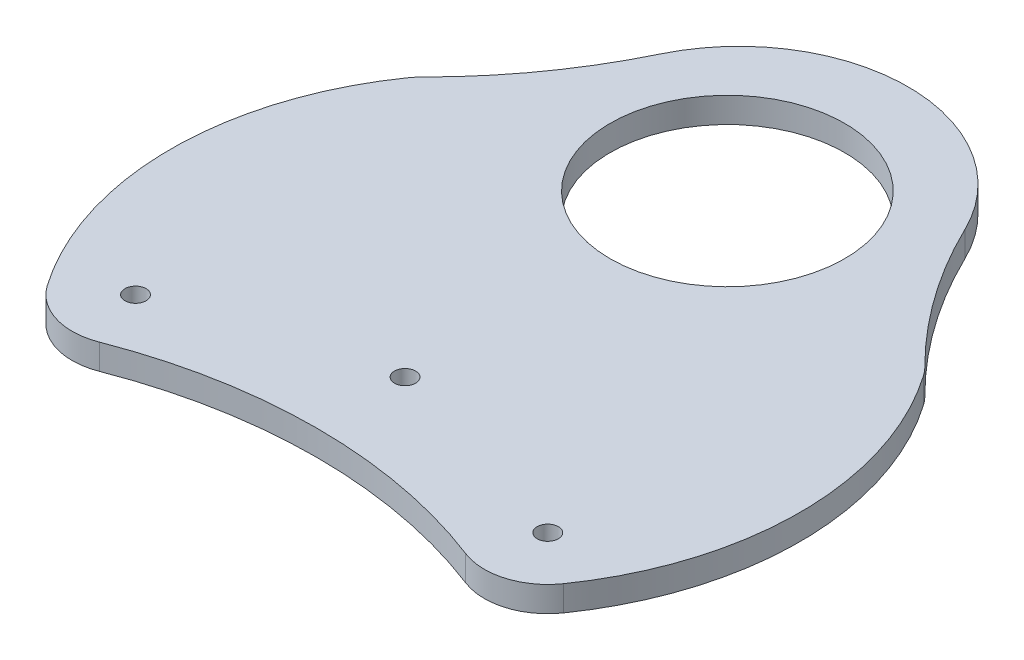
ISO-10303-21;
HEADER;
FILE_DESCRIPTION(('STEP AP214'),'2;1');
FILE_NAME('part.step','',(''),(''),'','','');
FILE_SCHEMA(('AUTOMOTIVE_DESIGN { 1 0 10303 214 1 1 1 1 }'));
ENDSEC;
DATA;
#1=APPLICATION_CONTEXT('core data for automotive mechanical design processes');
#2=APPLICATION_PROTOCOL_DEFINITION('international standard','automotive_design',2000,#1);
#3=PRODUCT_CONTEXT('',#1,'mechanical');
#4=PRODUCT('Part','Part','',(#3));
#5=PRODUCT_RELATED_PRODUCT_CATEGORY('part','',(#4));
#6=PRODUCT_DEFINITION_FORMATION('','',#4);
#7=PRODUCT_DEFINITION_CONTEXT('part definition',#1,'design');
#8=PRODUCT_DEFINITION('design','',#6,#7);
#9=PRODUCT_DEFINITION_SHAPE('','',#8);
#10=(LENGTH_UNIT() NAMED_UNIT(*) SI_UNIT(.MILLI.,.METRE.));
#11=(NAMED_UNIT(*) PLANE_ANGLE_UNIT() SI_UNIT($,.RADIAN.));
#12=(NAMED_UNIT(*) SI_UNIT($,.STERADIAN.) SOLID_ANGLE_UNIT());
#13=UNCERTAINTY_MEASURE_WITH_UNIT(LENGTH_MEASURE(1.E-05),#10,'distance_accuracy_value','');
#14=(GEOMETRIC_REPRESENTATION_CONTEXT(3) GLOBAL_UNCERTAINTY_ASSIGNED_CONTEXT((#13)) GLOBAL_UNIT_ASSIGNED_CONTEXT((#10,
#11,#12)) REPRESENTATION_CONTEXT('',''));
#15=CARTESIAN_POINT('',(0.,0.,0.));
#16=DIRECTION('',(0.,0.,1.));
#17=DIRECTION('',(1.,0.,0.));
#18=AXIS2_PLACEMENT_3D('',#15,#16,#17);
#19=CARTESIAN_POINT('',(-24.38193696765,3.,34.));
#20=DIRECTION('',(0.,-1.,0.));
#21=DIRECTION('',(0.,0.,-1.));
#22=AXIS2_PLACEMENT_3D('',#19,#20,#21);
#23=CYLINDRICAL_SURFACE('',#22,7.50000000000002);
#24=CARTESIAN_POINT('',(-24.38193696765,0.,34.));
#25=DIRECTION('',(0.,1.,0.));
#26=DIRECTION('',(0.,0.,1.));
#27=AXIS2_PLACEMENT_3D('',#24,#25,#26);
#28=CIRCLE('',#27,7.50000000000002);
#29=CARTESIAN_POINT('',(-30.534150333875,0.,38.2895536710062));
#30=VERTEX_POINT('',#29);
#31=CARTESIAN_POINT('',(-21.6728328601333,0.,40.993622447247));
#32=VERTEX_POINT('',#31);
#33=EDGE_CURVE('E148',#30,#32,#28,.T.);
#34=ORIENTED_EDGE('',*,*,#33,.T.);
#35=DIRECTION('',(0.,-1.,0.));
#36=VECTOR('',#35,1.);
#37=CARTESIAN_POINT('',(-21.6728328601333,3.,40.993622447247));
#38=LINE('',#37,#36);
#39=CARTESIAN_POINT('',(-21.6728328601333,3.,40.993622447247));
#40=VERTEX_POINT('',#39);
#41=EDGE_CURVE('E11',#40,#32,#38,.T.);
#42=ORIENTED_EDGE('',*,*,#41,.F.);
#43=CARTESIAN_POINT('',(-24.38193696765,3.,34.));
#44=DIRECTION('',(0.,1.,0.));
#45=DIRECTION('',(0.,0.,1.));
#46=AXIS2_PLACEMENT_3D('',#43,#44,#45);
#47=CIRCLE('',#46,7.50000000000002);
#48=CARTESIAN_POINT('',(-30.534150333875,3.,38.2895536710062));
#49=VERTEX_POINT('',#48);
#50=EDGE_CURVE('E175',#49,#40,#47,.T.);
#51=ORIENTED_EDGE('',*,*,#50,.F.);
#52=DIRECTION('',(0.,-1.,0.));
#53=VECTOR('',#52,1.);
#54=CARTESIAN_POINT('',(-30.534150333875,3.,38.2895536710062));
#55=LINE('',#54,#53);
#56=EDGE_CURVE('E53',#49,#30,#55,.T.);
#57=ORIENTED_EDGE('',*,*,#56,.T.);
#58=EDGE_LOOP('',(#34,#42,#51,#57));
#59=FACE_BOUND('',#58,.T.);
#60=ADVANCED_FACE('F37',(#59),#23,.T.);
#61=CARTESIAN_POINT('',(0.,3.,96.9426020252225));
#62=DIRECTION('',(0.,-1.,0.));
#63=DIRECTION('',(0.,0.,-1.));
#64=AXIS2_PLACEMENT_3D('',#61,#62,#63);
#65=CYLINDRICAL_SURFACE('',#64,60.);
#66=CARTESIAN_POINT('',(0.,0.,96.9426020252225));
#67=DIRECTION('',(0.,1.,0.));
#68=DIRECTION('',(0.,0.,1.));
#69=AXIS2_PLACEMENT_3D('',#66,#67,#68);
#70=CIRCLE('',#69,60.);
#71=CARTESIAN_POINT('',(21.6728328601333,0.,40.993622447247));
#72=VERTEX_POINT('',#71);
#73=EDGE_CURVE('E150',#32,#72,#70,.F.);
#74=ORIENTED_EDGE('',*,*,#73,.T.);
#75=DIRECTION('',(0.,-1.,0.));
#76=VECTOR('',#75,1.);
#77=CARTESIAN_POINT('',(21.6728328601333,3.,40.993622447247));
#78=LINE('',#77,#76);
#79=CARTESIAN_POINT('',(21.6728328601333,3.,40.993622447247));
#80=VERTEX_POINT('',#79);
#81=EDGE_CURVE('E45',#80,#72,#78,.T.);
#82=ORIENTED_EDGE('',*,*,#81,.F.);
#83=CARTESIAN_POINT('',(0.,3.,96.9426020252225));
#84=DIRECTION('',(0.,1.,0.));
#85=DIRECTION('',(0.,0.,1.));
#86=AXIS2_PLACEMENT_3D('',#83,#84,#85);
#87=CIRCLE('',#86,60.);
#88=EDGE_CURVE('E98',#40,#80,#87,.F.);
#89=ORIENTED_EDGE('',*,*,#88,.F.);
#90=ORIENTED_EDGE('',*,*,#41,.T.);
#91=EDGE_LOOP('',(#74,#82,#89,#90));
#92=FACE_BOUND('',#91,.T.);
#93=ADVANCED_FACE('F192',(#92),#65,.F.);
#94=CARTESIAN_POINT('',(24.38193696765,3.,34.));
#95=DIRECTION('',(0.,-1.,0.));
#96=DIRECTION('',(0.,0.,-1.));
#97=AXIS2_PLACEMENT_3D('',#94,#95,#96);
#98=CYLINDRICAL_SURFACE('',#97,7.50000000000001);
#99=CARTESIAN_POINT('',(24.38193696765,0.,34.));
#100=DIRECTION('',(0.,1.,0.));
#101=DIRECTION('',(0.,0.,1.));
#102=AXIS2_PLACEMENT_3D('',#99,#100,#101);
#103=CIRCLE('',#102,7.50000000000001);
#104=CARTESIAN_POINT('',(30.534150333875,0.,38.2895536710062));
#105=VERTEX_POINT('',#104);
#106=EDGE_CURVE('E154',#105,#72,#103,.F.);
#107=ORIENTED_EDGE('',*,*,#106,.F.);
#108=DIRECTION('',(0.,-1.,0.));
#109=VECTOR('',#108,1.);
#110=CARTESIAN_POINT('',(30.534150333875,3.,38.2895536710062));
#111=LINE('',#110,#109);
#112=CARTESIAN_POINT('',(30.534150333875,3.,38.2895536710062));
#113=VERTEX_POINT('',#112);
#114=EDGE_CURVE('E185',#113,#105,#111,.T.);
#115=ORIENTED_EDGE('',*,*,#114,.F.);
#116=CARTESIAN_POINT('',(24.38193696765,3.,34.));
#117=DIRECTION('',(0.,1.,0.));
#118=DIRECTION('',(0.,0.,1.));
#119=AXIS2_PLACEMENT_3D('',#116,#117,#118);
#120=CIRCLE('',#119,7.50000000000001);
#121=EDGE_CURVE('E191',#113,#80,#120,.F.);
#122=ORIENTED_EDGE('',*,*,#121,.T.);
#123=ORIENTED_EDGE('',*,*,#81,.T.);
#124=EDGE_LOOP('',(#107,#115,#122,#123));
#125=FACE_BOUND('',#124,.T.);
#126=ADVANCED_FACE('F189',(#125),#98,.T.);
#127=CARTESIAN_POINT('',(0.,3.,17.));
#128=DIRECTION('',(0.,-1.,0.));
#129=DIRECTION('',(0.,0.,-1.));
#130=AXIS2_PLACEMENT_3D('',#127,#128,#129);
#131=CYLINDRICAL_SURFACE('',#130,37.2233721218582);
#132=CARTESIAN_POINT('',(0.,0.,17.));
#133=DIRECTION('',(0.,1.,0.));
#134=DIRECTION('',(0.,0.,1.));
#135=AXIS2_PLACEMENT_3D('',#132,#133,#134);
#136=CIRCLE('',#135,37.2233721218582);
#137=CARTESIAN_POINT('',(30.534150333875,0.,-4.28955367100618));
#138=VERTEX_POINT('',#137);
#139=EDGE_CURVE('E157',#105,#138,#136,.T.);
#140=ORIENTED_EDGE('',*,*,#139,.T.);
#141=DIRECTION('',(0.,-1.,0.));
#142=VECTOR('',#141,1.);
#143=CARTESIAN_POINT('',(30.534150333875,3.,-4.28955367100618));
#144=LINE('',#143,#142);
#145=CARTESIAN_POINT('',(30.534150333875,3.,-4.28955367100618));
#146=VERTEX_POINT('',#145);
#147=EDGE_CURVE('E183',#146,#138,#144,.T.);
#148=ORIENTED_EDGE('',*,*,#147,.F.);
#149=CARTESIAN_POINT('',(0.,3.,17.));
#150=DIRECTION('',(0.,1.,0.));
#151=DIRECTION('',(0.,0.,1.));
#152=AXIS2_PLACEMENT_3D('',#149,#150,#151);
#153=CIRCLE('',#152,37.2233721218582);
#154=EDGE_CURVE('E203',#113,#146,#153,.T.);
#155=ORIENTED_EDGE('',*,*,#154,.F.);
#156=ORIENTED_EDGE('',*,*,#114,.T.);
#157=EDGE_LOOP('',(#140,#148,#155,#156));
#158=FACE_BOUND('',#157,.T.);
#159=ADVANCED_FACE('F200',(#158),#131,.T.);
#160=CARTESIAN_POINT('',(24.3819369676498,3.,1.12323345069498E-13));
#161=DIRECTION('',(0.,-1.,0.));
#162=DIRECTION('',(0.,0.,-1.));
#163=AXIS2_PLACEMENT_3D('',#160,#161,#162);
#164=CYLINDRICAL_SURFACE('',#163,7.50000000000022);
#165=CARTESIAN_POINT('',(24.3819369676498,0.,1.12323345069498E-13));
#166=DIRECTION('',(0.,1.,0.));
#167=DIRECTION('',(0.,0.,1.));
#168=AXIS2_PLACEMENT_3D('',#165,#166,#167);
#169=CIRCLE('',#168,7.50000000000022);
#170=CARTESIAN_POINT('',(29.6759557218346,0.,-5.31256674596581));
#171=VERTEX_POINT('',#170);
#172=EDGE_CURVE('E160',#171,#138,#169,.F.);
#173=ORIENTED_EDGE('',*,*,#172,.F.);
#174=DIRECTION('',(0.,-1.,0.));
#175=VECTOR('',#174,1.);
#176=CARTESIAN_POINT('',(29.6759557218346,3.,-5.31256674596581));
#177=LINE('',#176,#175);
#178=CARTESIAN_POINT('',(29.6759557218346,3.,-5.31256674596581));
#179=VERTEX_POINT('',#178);
#180=EDGE_CURVE('E181',#179,#171,#177,.T.);
#181=ORIENTED_EDGE('',*,*,#180,.F.);
#182=CARTESIAN_POINT('',(24.3819369676498,3.,1.12323345069498E-13));
#183=DIRECTION('',(0.,1.,0.));
#184=DIRECTION('',(0.,0.,1.));
#185=AXIS2_PLACEMENT_3D('',#182,#183,#184);
#186=CIRCLE('',#185,7.50000000000022);
#187=EDGE_CURVE('E205',#179,#146,#186,.F.);
#188=ORIENTED_EDGE('',*,*,#187,.T.);
#189=ORIENTED_EDGE('',*,*,#147,.T.);
#190=EDGE_LOOP('',(#173,#181,#188,#189));
#191=FACE_BOUND('',#190,.T.);
#192=ADVANCED_FACE('F355',(#191),#164,.T.);
#193=CARTESIAN_POINT('',(72.0281057553105,3.,-47.8131007136917));
#194=DIRECTION('',(0.,-1.,0.));
#195=DIRECTION('',(0.,0.,-1.));
#196=AXIS2_PLACEMENT_3D('',#193,#194,#195);
#197=CYLINDRICAL_SURFACE('',#196,59.999999999999);
#198=CARTESIAN_POINT('',(72.0281057553105,0.,-47.8131007136917));
#199=DIRECTION('',(0.,1.,0.));
#200=DIRECTION('',(0.,0.,1.));
#201=AXIS2_PLACEMENT_3D('',#198,#199,#200);
#202=CIRCLE('',#201,59.999999999999);
#203=CARTESIAN_POINT('',(18.0070264388278,0.,-21.7032751784231));
#204=VERTEX_POINT('',#203);
#205=EDGE_CURVE('E163',#204,#171,#202,.T.);
#206=ORIENTED_EDGE('',*,*,#205,.F.);
#207=DIRECTION('',(0.,-1.,0.));
#208=VECTOR('',#207,1.);
#209=CARTESIAN_POINT('',(18.0070264388278,3.,-21.7032751784231));
#210=LINE('',#209,#208);
#211=CARTESIAN_POINT('',(18.0070264388278,3.,-21.7032751784231));
#212=VERTEX_POINT('',#211);
#213=EDGE_CURVE('E179',#212,#204,#210,.T.);
#214=ORIENTED_EDGE('',*,*,#213,.F.);
#215=CARTESIAN_POINT('',(72.0281057553105,3.,-47.8131007136917));
#216=DIRECTION('',(0.,1.,0.));
#217=DIRECTION('',(0.,0.,1.));
#218=AXIS2_PLACEMENT_3D('',#215,#216,#217);
#219=CIRCLE('',#218,59.999999999999);
#220=EDGE_CURVE('E143',#212,#179,#219,.T.);
#221=ORIENTED_EDGE('',*,*,#220,.T.);
#222=ORIENTED_EDGE('',*,*,#180,.T.);
#223=EDGE_LOOP('',(#206,#214,#221,#222));
#224=FACE_BOUND('',#223,.T.);
#225=ADVANCED_FACE('F214',(#224),#197,.F.);
#226=CARTESIAN_POINT('',(0.,3.,-13.));
#227=DIRECTION('',(0.,-1.,0.));
#228=DIRECTION('',(0.,0.,-1.));
#229=AXIS2_PLACEMENT_3D('',#226,#227,#228);
#230=CYLINDRICAL_SURFACE('',#229,20.);
#231=CARTESIAN_POINT('',(0.,0.,-13.));
#232=DIRECTION('',(0.,1.,0.));
#233=DIRECTION('',(0.,0.,1.));
#234=AXIS2_PLACEMENT_3D('',#231,#232,#233);
#235=CIRCLE('',#234,20.);
#236=CARTESIAN_POINT('',(-18.0070264388278,0.,-21.7032751784231));
#237=VERTEX_POINT('',#236);
#238=EDGE_CURVE('E166',#237,#204,#235,.F.);
#239=ORIENTED_EDGE('',*,*,#238,.F.);
#240=DIRECTION('',(0.,-1.,0.));
#241=VECTOR('',#240,1.);
#242=CARTESIAN_POINT('',(-18.0070264388278,3.,-21.7032751784231));
#243=LINE('',#242,#241);
#244=CARTESIAN_POINT('',(-18.0070264388278,3.,-21.7032751784231));
#245=VERTEX_POINT('',#244);
#246=EDGE_CURVE('E129',#245,#237,#243,.T.);
#247=ORIENTED_EDGE('',*,*,#246,.F.);
#248=CARTESIAN_POINT('',(0.,3.,-13.));
#249=DIRECTION('',(0.,1.,0.));
#250=DIRECTION('',(0.,0.,1.));
#251=AXIS2_PLACEMENT_3D('',#248,#249,#250);
#252=CIRCLE('',#251,20.);
#253=EDGE_CURVE('E141',#245,#212,#252,.F.);
#254=ORIENTED_EDGE('',*,*,#253,.T.);
#255=ORIENTED_EDGE('',*,*,#213,.T.);
#256=EDGE_LOOP('',(#239,#247,#254,#255));
#257=FACE_BOUND('',#256,.T.);
#258=ADVANCED_FACE('F217',(#257),#230,.T.);
#259=CARTESIAN_POINT('',(-72.0281057553105,3.,-47.8131007136917));
#260=DIRECTION('',(0.,-1.,0.));
#261=DIRECTION('',(0.,0.,-1.));
#262=AXIS2_PLACEMENT_3D('',#259,#260,#261);
#263=CYLINDRICAL_SURFACE('',#262,59.999999999999);
#264=CARTESIAN_POINT('',(-72.0281057553105,0.,-47.8131007136917));
#265=DIRECTION('',(0.,1.,0.));
#266=DIRECTION('',(0.,0.,1.));
#267=AXIS2_PLACEMENT_3D('',#264,#265,#266);
#268=CIRCLE('',#267,59.999999999999);
#269=CARTESIAN_POINT('',(-29.6759557218346,0.,-5.31256674596581));
#270=VERTEX_POINT('',#269);
#271=EDGE_CURVE('E126',#270,#237,#268,.T.);
#272=ORIENTED_EDGE('',*,*,#271,.F.);
#273=DIRECTION('',(0.,-1.,0.));
#274=VECTOR('',#273,1.);
#275=CARTESIAN_POINT('',(-29.6759557218346,3.,-5.31256674596581));
#276=LINE('',#275,#274);
#277=CARTESIAN_POINT('',(-29.6759557218346,3.,-5.31256674596581));
#278=VERTEX_POINT('',#277);
#279=EDGE_CURVE('E120',#278,#270,#276,.T.);
#280=ORIENTED_EDGE('',*,*,#279,.F.);
#281=CARTESIAN_POINT('',(-72.0281057553105,3.,-47.8131007136917));
#282=DIRECTION('',(0.,1.,0.));
#283=DIRECTION('',(0.,0.,1.));
#284=AXIS2_PLACEMENT_3D('',#281,#282,#283);
#285=CIRCLE('',#284,59.999999999999);
#286=EDGE_CURVE('E124',#278,#245,#285,.T.);
#287=ORIENTED_EDGE('',*,*,#286,.T.);
#288=ORIENTED_EDGE('',*,*,#246,.T.);
#289=EDGE_LOOP('',(#272,#280,#287,#288));
#290=FACE_BOUND('',#289,.T.);
#291=ADVANCED_FACE('F122',(#290),#263,.F.);
#292=CARTESIAN_POINT('',(-24.3819369676501,3.,0.));
#293=DIRECTION('',(0.,-1.,0.));
#294=DIRECTION('',(0.,0.,-1.));
#295=AXIS2_PLACEMENT_3D('',#292,#293,#294);
#296=CYLINDRICAL_SURFACE('',#295,7.4999999999999);
#297=CARTESIAN_POINT('',(-24.3819369676501,0.,0.));
#298=DIRECTION('',(0.,1.,0.));
#299=DIRECTION('',(0.,0.,1.));
#300=AXIS2_PLACEMENT_3D('',#297,#298,#299);
#301=CIRCLE('',#300,7.4999999999999);
#302=CARTESIAN_POINT('',(-30.534150333875,0.,-4.28955367100618));
#303=VERTEX_POINT('',#302);
#304=EDGE_CURVE('E170',#270,#303,#301,.T.);
#305=ORIENTED_EDGE('',*,*,#304,.T.);
#306=DIRECTION('',(0.,-1.,0.));
#307=VECTOR('',#306,1.);
#308=CARTESIAN_POINT('',(-30.534150333875,3.,-4.28955367100618));
#309=LINE('',#308,#307);
#310=CARTESIAN_POINT('',(-30.534150333875,3.,-4.28955367100618));
#311=VERTEX_POINT('',#310);
#312=EDGE_CURVE('E86',#311,#303,#309,.T.);
#313=ORIENTED_EDGE('',*,*,#312,.F.);
#314=CARTESIAN_POINT('',(-24.3819369676501,3.,0.));
#315=DIRECTION('',(0.,1.,0.));
#316=DIRECTION('',(0.,0.,1.));
#317=AXIS2_PLACEMENT_3D('',#314,#315,#316);
#318=CIRCLE('',#317,7.4999999999999);
#319=EDGE_CURVE('E131',#278,#311,#318,.T.);
#320=ORIENTED_EDGE('',*,*,#319,.F.);
#321=ORIENTED_EDGE('',*,*,#279,.T.);
#322=EDGE_LOOP('',(#305,#313,#320,#321));
#323=FACE_BOUND('',#322,.T.);
#324=ADVANCED_FACE('F132',(#323),#296,.T.);
#325=CARTESIAN_POINT('',(0.,3.,17.));
#326=DIRECTION('',(0.,-1.,0.));
#327=DIRECTION('',(0.,0.,-1.));
#328=AXIS2_PLACEMENT_3D('',#325,#326,#327);
#329=CYLINDRICAL_SURFACE('',#328,37.2233721218582);
#330=CARTESIAN_POINT('',(0.,0.,17.));
#331=DIRECTION('',(0.,1.,0.));
#332=DIRECTION('',(0.,0.,1.));
#333=AXIS2_PLACEMENT_3D('',#330,#331,#332);
#334=CIRCLE('',#333,37.2233721218582);
#335=EDGE_CURVE('E172',#30,#303,#334,.F.);
#336=ORIENTED_EDGE('',*,*,#335,.F.);
#337=ORIENTED_EDGE('',*,*,#56,.F.);
#338=CARTESIAN_POINT('',(0.,3.,17.));
#339=DIRECTION('',(0.,1.,0.));
#340=DIRECTION('',(0.,0.,1.));
#341=AXIS2_PLACEMENT_3D('',#338,#339,#340);
#342=CIRCLE('',#341,37.2233721218582);
#343=EDGE_CURVE('E135',#49,#311,#342,.F.);
#344=ORIENTED_EDGE('',*,*,#343,.T.);
#345=ORIENTED_EDGE('',*,*,#312,.T.);
#346=EDGE_LOOP('',(#336,#337,#344,#345));
#347=FACE_BOUND('',#346,.T.);
#348=ADVANCED_FACE('F218',(#347),#329,.T.);
#349=CARTESIAN_POINT('',(0.,3.,0.));
#350=DIRECTION('',(0.,1.,0.));
#351=DIRECTION('',(0.,0.,1.));
#352=AXIS2_PLACEMENT_3D('',#349,#350,#351);
#353=PLANE('',#352);
#354=CARTESIAN_POINT('',(0.,3.,-11.63));
#355=DIRECTION('',(0.,1.,0.));
#356=DIRECTION('',(0.,0.,1.));
#357=AXIS2_PLACEMENT_3D('',#354,#355,#356);
#358=CIRCLE('',#357,13.875);
#359=CARTESIAN_POINT('',(0.,3.,2.245));
#360=VERTEX_POINT('',#359);
#361=EDGE_CURVE('E252',#360,#360,#358,.T.);
#362=ORIENTED_EDGE('',*,*,#361,.F.);
#363=EDGE_LOOP('',(#362));
#364=FACE_BOUND('',#363,.T.);
#365=CARTESIAN_POINT('',(2.44975397137367E-11,3.,26.5));
#366=DIRECTION('',(0.,1.,0.));
#367=DIRECTION('',(0.,0.,1.));
#368=AXIS2_PLACEMENT_3D('',#365,#366,#367);
#369=CIRCLE('',#368,1.25);
#370=CARTESIAN_POINT('',(2.44975397137367E-11,3.,27.75));
#371=VERTEX_POINT('',#370);
#372=EDGE_CURVE('E246',#371,#371,#369,.T.);
#373=ORIENTED_EDGE('',*,*,#372,.F.);
#374=EDGE_LOOP('',(#373));
#375=FACE_BOUND('',#374,.T.);
#376=CARTESIAN_POINT('',(24.38193696765,3.,34.));
#377=DIRECTION('',(0.,1.,0.));
#378=DIRECTION('',(0.,0.,1.));
#379=AXIS2_PLACEMENT_3D('',#376,#377,#378);
#380=CIRCLE('',#379,1.25);
#381=CARTESIAN_POINT('',(24.38193696765,3.,35.25));
#382=VERTEX_POINT('',#381);
#383=EDGE_CURVE('E240',#382,#382,#380,.T.);
#384=ORIENTED_EDGE('',*,*,#383,.F.);
#385=EDGE_LOOP('',(#384));
#386=FACE_BOUND('',#385,.T.);
#387=CARTESIAN_POINT('',(-24.38193696765,3.,34.));
#388=DIRECTION('',(0.,1.,0.));
#389=DIRECTION('',(0.,0.,1.));
#390=AXIS2_PLACEMENT_3D('',#387,#388,#389);
#391=CIRCLE('',#390,1.25);
#392=CARTESIAN_POINT('',(-24.38193696765,3.,35.25));
#393=VERTEX_POINT('',#392);
#394=EDGE_CURVE('E234',#393,#393,#391,.T.);
#395=ORIENTED_EDGE('',*,*,#394,.F.);
#396=EDGE_LOOP('',(#395));
#397=FACE_BOUND('',#396,.T.);
#398=ORIENTED_EDGE('',*,*,#50,.T.);
#399=ORIENTED_EDGE('',*,*,#88,.T.);
#400=ORIENTED_EDGE('',*,*,#121,.F.);
#401=ORIENTED_EDGE('',*,*,#154,.T.);
#402=ORIENTED_EDGE('',*,*,#187,.F.);
#403=ORIENTED_EDGE('',*,*,#220,.F.);
#404=ORIENTED_EDGE('',*,*,#253,.F.);
#405=ORIENTED_EDGE('',*,*,#286,.F.);
#406=ORIENTED_EDGE('',*,*,#319,.T.);
#407=ORIENTED_EDGE('',*,*,#343,.F.);
#408=EDGE_LOOP('',(#398,#399,#400,#401,#402,#403,#404,#405,#406,#407));
#409=FACE_BOUND('',#408,.T.);
#410=ADVANCED_FACE('F138',(#364,#375,#386,#397,#409),#353,.T.);
#411=CARTESIAN_POINT('',(0.,0.,0.));
#412=DIRECTION('',(0.,1.,0.));
#413=DIRECTION('',(0.,0.,1.));
#414=AXIS2_PLACEMENT_3D('',#411,#412,#413);
#415=PLANE('',#414);
#416=CARTESIAN_POINT('',(0.,0.,-11.63));
#417=DIRECTION('',(0.,1.,0.));
#418=DIRECTION('',(0.,0.,1.));
#419=AXIS2_PLACEMENT_3D('',#416,#417,#418);
#420=CIRCLE('',#419,13.875);
#421=CARTESIAN_POINT('',(0.,0.,2.245));
#422=VERTEX_POINT('',#421);
#423=EDGE_CURVE('E249',#422,#422,#420,.T.);
#424=ORIENTED_EDGE('',*,*,#423,.T.);
#425=EDGE_LOOP('',(#424));
#426=FACE_BOUND('',#425,.T.);
#427=CARTESIAN_POINT('',(2.44975397137367E-11,0.,26.5));
#428=DIRECTION('',(0.,1.,0.));
#429=DIRECTION('',(0.,0.,1.));
#430=AXIS2_PLACEMENT_3D('',#427,#428,#429);
#431=CIRCLE('',#430,1.25);
#432=CARTESIAN_POINT('',(2.44975397137367E-11,0.,27.75));
#433=VERTEX_POINT('',#432);
#434=EDGE_CURVE('E243',#433,#433,#431,.T.);
#435=ORIENTED_EDGE('',*,*,#434,.T.);
#436=EDGE_LOOP('',(#435));
#437=FACE_BOUND('',#436,.T.);
#438=CARTESIAN_POINT('',(24.38193696765,0.,34.));
#439=DIRECTION('',(0.,1.,0.));
#440=DIRECTION('',(0.,0.,1.));
#441=AXIS2_PLACEMENT_3D('',#438,#439,#440);
#442=CIRCLE('',#441,1.25);
#443=CARTESIAN_POINT('',(24.38193696765,0.,35.25));
#444=VERTEX_POINT('',#443);
#445=EDGE_CURVE('E237',#444,#444,#442,.T.);
#446=ORIENTED_EDGE('',*,*,#445,.T.);
#447=EDGE_LOOP('',(#446));
#448=FACE_BOUND('',#447,.T.);
#449=CARTESIAN_POINT('',(-24.38193696765,0.,34.));
#450=DIRECTION('',(0.,1.,0.));
#451=DIRECTION('',(0.,0.,1.));
#452=AXIS2_PLACEMENT_3D('',#449,#450,#451);
#453=CIRCLE('',#452,1.25);
#454=CARTESIAN_POINT('',(-24.38193696765,0.,35.25));
#455=VERTEX_POINT('',#454);
#456=EDGE_CURVE('E151',#455,#455,#453,.T.);
#457=ORIENTED_EDGE('',*,*,#456,.T.);
#458=EDGE_LOOP('',(#457));
#459=FACE_BOUND('',#458,.T.);
#460=ORIENTED_EDGE('',*,*,#33,.F.);
#461=ORIENTED_EDGE('',*,*,#335,.T.);
#462=ORIENTED_EDGE('',*,*,#304,.F.);
#463=ORIENTED_EDGE('',*,*,#271,.T.);
#464=ORIENTED_EDGE('',*,*,#238,.T.);
#465=ORIENTED_EDGE('',*,*,#205,.T.);
#466=ORIENTED_EDGE('',*,*,#172,.T.);
#467=ORIENTED_EDGE('',*,*,#139,.F.);
#468=ORIENTED_EDGE('',*,*,#106,.T.);
#469=ORIENTED_EDGE('',*,*,#73,.F.);
#470=EDGE_LOOP('',(#460,#461,#462,#463,#464,#465,#466,#467,#468,#469));
#471=FACE_BOUND('',#470,.T.);
#472=ADVANCED_FACE('F196',(#426,#437,#448,#459,#471),#415,.F.);
#473=CARTESIAN_POINT('',(-24.38193696765,0.,34.));
#474=DIRECTION('',(0.,1.,0.));
#475=DIRECTION('',(0.,0.,1.));
#476=AXIS2_PLACEMENT_3D('',#473,#474,#475);
#477=CYLINDRICAL_SURFACE('',#476,1.25);
#478=ORIENTED_EDGE('',*,*,#456,.F.);
#479=EDGE_LOOP('',(#478));
#480=FACE_BOUND('',#479,.T.);
#481=ORIENTED_EDGE('',*,*,#394,.T.);
#482=EDGE_LOOP('',(#481));
#483=FACE_BOUND('',#482,.T.);
#484=ADVANCED_FACE('F273',(#480,#483),#477,.F.);
#485=CARTESIAN_POINT('',(24.38193696765,0.,34.));
#486=DIRECTION('',(0.,1.,0.));
#487=DIRECTION('',(0.,0.,1.));
#488=AXIS2_PLACEMENT_3D('',#485,#486,#487);
#489=CYLINDRICAL_SURFACE('',#488,1.25);
#490=ORIENTED_EDGE('',*,*,#445,.F.);
#491=EDGE_LOOP('',(#490));
#492=FACE_BOUND('',#491,.T.);
#493=ORIENTED_EDGE('',*,*,#383,.T.);
#494=EDGE_LOOP('',(#493));
#495=FACE_BOUND('',#494,.T.);
#496=ADVANCED_FACE('F275',(#492,#495),#489,.F.);
#497=CARTESIAN_POINT('',(2.44975397137367E-11,0.,26.5));
#498=DIRECTION('',(0.,1.,0.));
#499=DIRECTION('',(0.,0.,1.));
#500=AXIS2_PLACEMENT_3D('',#497,#498,#499);
#501=CYLINDRICAL_SURFACE('',#500,1.25);
#502=ORIENTED_EDGE('',*,*,#434,.F.);
#503=EDGE_LOOP('',(#502));
#504=FACE_BOUND('',#503,.T.);
#505=ORIENTED_EDGE('',*,*,#372,.T.);
#506=EDGE_LOOP('',(#505));
#507=FACE_BOUND('',#506,.T.);
#508=ADVANCED_FACE('F263',(#504,#507),#501,.F.);
#509=CARTESIAN_POINT('',(0.,0.,-11.63));
#510=DIRECTION('',(0.,1.,0.));
#511=DIRECTION('',(0.,0.,1.));
#512=AXIS2_PLACEMENT_3D('',#509,#510,#511);
#513=CYLINDRICAL_SURFACE('',#512,13.875);
#514=ORIENTED_EDGE('',*,*,#423,.F.);
#515=EDGE_LOOP('',(#514));
#516=FACE_BOUND('',#515,.T.);
#517=ORIENTED_EDGE('',*,*,#361,.T.);
#518=EDGE_LOOP('',(#517));
#519=FACE_BOUND('',#518,.T.);
#520=ADVANCED_FACE('F260',(#516,#519),#513,.F.);
#521=CLOSED_SHELL('',(#60,#93,#126,#159,#192,#225,#258,#291,#324,#348,#410,#472,#484,#496,#508,#520));
#522=MANIFOLD_SOLID_BREP('B2',#521);
#523=ADVANCED_BREP_SHAPE_REPRESENTATION('',(#18,#522),#14);
#524=SHAPE_DEFINITION_REPRESENTATION(#9,#523);
ENDSEC;
END-ISO-10303-21;
